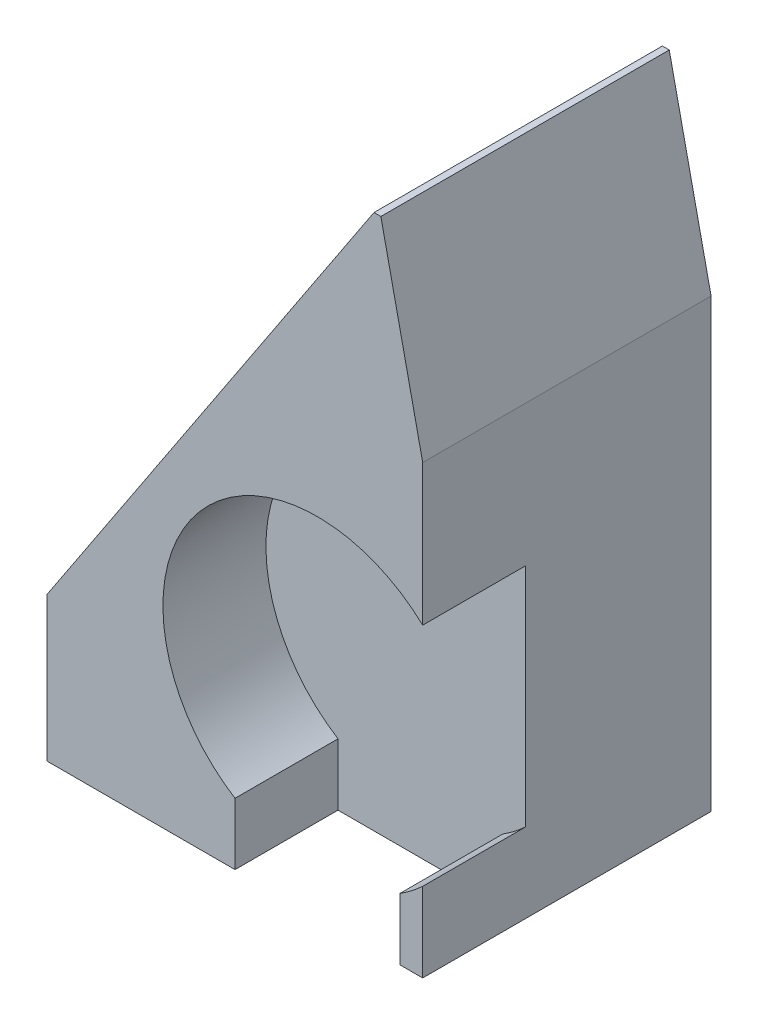
ISO-10303-21;
HEADER;
FILE_DESCRIPTION(('STEP AP214'),'2;1');
FILE_NAME('part.step','',(''),(''),'','','');
FILE_SCHEMA(('AUTOMOTIVE_DESIGN { 1 0 10303 214 1 1 1 1 }'));
ENDSEC;
DATA;
#1=APPLICATION_CONTEXT('core data for automotive mechanical design processes');
#2=APPLICATION_PROTOCOL_DEFINITION('international standard','automotive_design',2000,#1);
#3=PRODUCT_CONTEXT('',#1,'mechanical');
#4=PRODUCT('Part','Part','',(#3));
#5=PRODUCT_RELATED_PRODUCT_CATEGORY('part','',(#4));
#6=PRODUCT_DEFINITION_FORMATION('','',#4);
#7=PRODUCT_DEFINITION_CONTEXT('part definition',#1,'design');
#8=PRODUCT_DEFINITION('design','',#6,#7);
#9=PRODUCT_DEFINITION_SHAPE('','',#8);
#10=(LENGTH_UNIT() NAMED_UNIT(*) SI_UNIT(.MILLI.,.METRE.));
#11=(NAMED_UNIT(*) PLANE_ANGLE_UNIT() SI_UNIT($,.RADIAN.));
#12=(NAMED_UNIT(*) SI_UNIT($,.STERADIAN.) SOLID_ANGLE_UNIT());
#13=UNCERTAINTY_MEASURE_WITH_UNIT(LENGTH_MEASURE(1.E-05),#10,'distance_accuracy_value','');
#14=(GEOMETRIC_REPRESENTATION_CONTEXT(3) GLOBAL_UNCERTAINTY_ASSIGNED_CONTEXT((#13)) GLOBAL_UNIT_ASSIGNED_CONTEXT((#10,
#11,#12)) REPRESENTATION_CONTEXT('',''));
#15=CARTESIAN_POINT('',(0.,0.,0.));
#16=DIRECTION('',(0.,0.,1.));
#17=DIRECTION('',(1.,0.,0.));
#18=AXIS2_PLACEMENT_3D('',#15,#16,#17);
#19=CARTESIAN_POINT('',(0.,0.,70.));
#20=DIRECTION('',(0.,0.,1.));
#21=DIRECTION('',(1.,0.,0.));
#22=AXIS2_PLACEMENT_3D('',#19,#20,#21);
#23=PLANE('',#22);
#24=CARTESIAN_POINT('',(-22.6679084803781,-28.7734336982965,70.));
#25=DIRECTION('',(0.,0.,1.));
#26=DIRECTION('',(1.,0.,0.));
#27=AXIS2_PLACEMENT_3D('',#24,#25,#26);
#28=CIRCLE('',#27,37.5);
#29=CARTESIAN_POINT('',(2.88209151962222,-1.3244355380724,70.));
#30=VERTEX_POINT('',#29);
#31=CARTESIAN_POINT('',(-42.6721194220356,-60.4922222092354,70.));
#32=VERTEX_POINT('',#31);
#33=EDGE_CURVE('E190',#30,#32,#28,.T.);
#34=ORIENTED_EDGE('',*,*,#33,.F.);
#35=DIRECTION('',(0.,1.,0.));
#36=VECTOR('',#35,1.);
#37=CARTESIAN_POINT('',(2.88209151962222,-40.4922222092354,70.));
#38=LINE('',#37,#36);
#39=CARTESIAN_POINT('',(2.88209151962222,32.8600757047892,70.));
#40=VERTEX_POINT('',#39);
#41=EDGE_CURVE('E204',#30,#40,#38,.T.);
#42=ORIENTED_EDGE('',*,*,#41,.T.);
#43=DIRECTION('',(-0.212686858193503,0.977120412411785,0.));
#44=VECTOR('',#43,1.);
#45=CARTESIAN_POINT('',(2.88209151962222,32.8600757047892,70.));
#46=LINE('',#45,#44);
#47=CARTESIAN_POINT('',(-7.27157334356914,79.5077777907646,70.));
#48=VERTEX_POINT('',#47);
#49=EDGE_CURVE('E206',#40,#48,#46,.T.);
#50=ORIENTED_EDGE('',*,*,#49,.T.);
#51=DIRECTION('',(-1.,0.,0.));
#52=VECTOR('',#51,1.);
#53=CARTESIAN_POINT('',(-7.27157334356914,79.5077777907646,70.));
#54=LINE('',#53,#52);
#55=CARTESIAN_POINT('',(-8.93782976289527,79.5077777907646,70.));
#56=VERTEX_POINT('',#55);
#57=EDGE_CURVE('E54',#48,#56,#54,.T.);
#58=ORIENTED_EDGE('',*,*,#57,.T.);
#59=DIRECTION('',(-0.551769207168103,-0.833996847728505,0.));
#60=VECTOR('',#59,1.);
#61=CARTESIAN_POINT('',(-8.93782976289527,79.5077777907646,70.));
#62=LINE('',#61,#60);
#63=CARTESIAN_POINT('',(-88.3293826692521,-40.4922222092354,70.));
#64=VERTEX_POINT('',#63);
#65=EDGE_CURVE('E80',#56,#64,#62,.T.);
#66=ORIENTED_EDGE('',*,*,#65,.T.);
#67=DIRECTION('',(0.,1.,0.));
#68=VECTOR('',#67,1.);
#69=CARTESIAN_POINT('',(-88.3293826692521,-60.4922222092354,70.));
#70=LINE('',#69,#68);
#71=CARTESIAN_POINT('',(-88.3293826692521,-75.4922222092354,70.));
#72=VERTEX_POINT('',#71);
#73=EDGE_CURVE('E198',#72,#64,#70,.T.);
#74=ORIENTED_EDGE('',*,*,#73,.F.);
#75=DIRECTION('',(-1.,0.,0.));
#76=VECTOR('',#75,1.);
#77=CARTESIAN_POINT('',(-42.6721194220356,-75.4922222092354,70.));
#78=LINE('',#77,#76);
#79=CARTESIAN_POINT('',(-42.6721194220356,-75.4922222092354,70.));
#80=VERTEX_POINT('',#79);
#81=EDGE_CURVE('E169',#80,#72,#78,.T.);
#82=ORIENTED_EDGE('',*,*,#81,.F.);
#83=DIRECTION('',(0.,1.,0.));
#84=VECTOR('',#83,1.);
#85=CARTESIAN_POINT('',(-42.6721194220356,-75.4922222092354,70.));
#86=LINE('',#85,#84);
#87=EDGE_CURVE('E172',#80,#32,#86,.T.);
#88=ORIENTED_EDGE('',*,*,#87,.T.);
#89=EDGE_LOOP('',(#34,#42,#50,#58,#66,#74,#82,#88));
#90=FACE_BOUND('',#89,.T.);
#91=ADVANCED_FACE('F37',(#90),#23,.T.);
#92=CARTESIAN_POINT('',(-8.93782976289527,79.5077777907646,70.));
#93=DIRECTION('',(0.833996847728505,-0.551769207168103,0.));
#94=DIRECTION('',(0.551769207168103,0.833996847728505,0.));
#95=AXIS2_PLACEMENT_3D('',#92,#93,#94);
#96=PLANE('',#95);
#97=DIRECTION('',(-0.551769207168103,-0.833996847728505,0.));
#98=VECTOR('',#97,1.);
#99=CARTESIAN_POINT('',(-8.93782976289527,79.5077777907646,0.));
#100=LINE('',#99,#98);
#101=CARTESIAN_POINT('',(-8.93782976289527,79.5077777907646,0.));
#102=VERTEX_POINT('',#101);
#103=CARTESIAN_POINT('',(-88.3293826692521,-40.4922222092354,0.));
#104=VERTEX_POINT('',#103);
#105=EDGE_CURVE('E142',#102,#104,#100,.T.);
#106=ORIENTED_EDGE('',*,*,#105,.T.);
#107=DIRECTION('',(0.,0.,-1.));
#108=VECTOR('',#107,1.);
#109=CARTESIAN_POINT('',(-88.3293826692521,-40.4922222092354,70.));
#110=LINE('',#109,#108);
#111=EDGE_CURVE('E218',#64,#104,#110,.T.);
#112=ORIENTED_EDGE('',*,*,#111,.F.);
#113=ORIENTED_EDGE('',*,*,#65,.F.);
#114=DIRECTION('',(0.,0.,-1.));
#115=VECTOR('',#114,1.);
#116=CARTESIAN_POINT('',(-8.93782976289527,79.5077777907646,70.));
#117=LINE('',#116,#115);
#118=EDGE_CURVE('E209',#56,#102,#117,.T.);
#119=ORIENTED_EDGE('',*,*,#118,.T.);
#120=EDGE_LOOP('',(#106,#112,#113,#119));
#121=FACE_BOUND('',#120,.T.);
#122=ADVANCED_FACE('F39',(#121),#96,.F.);
#123=CARTESIAN_POINT('',(2.88209151962222,-40.4922222092354,70.));
#124=DIRECTION('',(-1.,0.,0.));
#125=DIRECTION('',(0.,0.,1.));
#126=AXIS2_PLACEMENT_3D('',#123,#124,#125);
#127=PLANE('',#126);
#128=DIRECTION('',(0.,1.,0.));
#129=VECTOR('',#128,1.);
#130=CARTESIAN_POINT('',(2.88209151962222,-40.4922222092354,45.));
#131=LINE('',#130,#129);
#132=CARTESIAN_POINT('',(2.88209151962222,-56.2224318585206,45.));
#133=VERTEX_POINT('',#132);
#134=CARTESIAN_POINT('',(2.88209151962222,-1.3244355380724,45.));
#135=VERTEX_POINT('',#134);
#136=EDGE_CURVE('E188',#133,#135,#131,.T.);
#137=ORIENTED_EDGE('',*,*,#136,.F.);
#138=DIRECTION('',(0.,0.,1.));
#139=VECTOR('',#138,1.);
#140=CARTESIAN_POINT('',(2.88209151962222,-56.2224318585206,45.));
#141=LINE('',#140,#139);
#142=CARTESIAN_POINT('',(2.88209151962222,-56.2224318585206,70.));
#143=VERTEX_POINT('',#142);
#144=EDGE_CURVE('E196',#133,#143,#141,.T.);
#145=ORIENTED_EDGE('',*,*,#144,.T.);
#146=CARTESIAN_POINT('',(2.88209151962223,-75.4922222092354,70.));
#147=VERTEX_POINT('',#146);
#148=EDGE_CURVE('E150',#147,#143,#38,.T.);
#149=ORIENTED_EDGE('',*,*,#148,.F.);
#150=DIRECTION('',(0.,0.,1.));
#151=VECTOR('',#150,1.);
#152=CARTESIAN_POINT('',(2.88209151962223,-75.4922222092354,0.));
#153=LINE('',#152,#151);
#154=CARTESIAN_POINT('',(2.88209151962223,-75.4922222092354,0.));
#155=VERTEX_POINT('',#154);
#156=EDGE_CURVE('E145',#155,#147,#153,.T.);
#157=ORIENTED_EDGE('',*,*,#156,.F.);
#158=DIRECTION('',(0.,1.,0.));
#159=VECTOR('',#158,1.);
#160=CARTESIAN_POINT('',(2.88209151962222,-40.4922222092354,0.));
#161=LINE('',#160,#159);
#162=CARTESIAN_POINT('',(2.88209151962222,32.8600757047892,0.));
#163=VERTEX_POINT('',#162);
#164=EDGE_CURVE('E133',#155,#163,#161,.T.);
#165=ORIENTED_EDGE('',*,*,#164,.T.);
#166=DIRECTION('',(0.,0.,-1.));
#167=VECTOR('',#166,1.);
#168=CARTESIAN_POINT('',(2.88209151962222,32.8600757047892,70.));
#169=LINE('',#168,#167);
#170=EDGE_CURVE('E216',#40,#163,#169,.T.);
#171=ORIENTED_EDGE('',*,*,#170,.F.);
#172=ORIENTED_EDGE('',*,*,#41,.F.);
#173=DIRECTION('',(0.,0.,1.));
#174=VECTOR('',#173,1.);
#175=CARTESIAN_POINT('',(2.88209151962222,-1.3244355380724,45.));
#176=LINE('',#175,#174);
#177=EDGE_CURVE('E193',#30,#135,#176,.F.);
#178=ORIENTED_EDGE('',*,*,#177,.T.);
#179=EDGE_LOOP('',(#137,#145,#149,#157,#165,#171,#172,#178));
#180=FACE_BOUND('',#179,.T.);
#181=ADVANCED_FACE('F147',(#180),#127,.F.);
#182=CARTESIAN_POINT('',(2.88209151962222,32.8600757047892,70.));
#183=DIRECTION('',(-0.977120412411785,-0.212686858193503,0.));
#184=DIRECTION('',(0.212686858193503,-0.977120412411785,0.));
#185=AXIS2_PLACEMENT_3D('',#182,#183,#184);
#186=PLANE('',#185);
#187=DIRECTION('',(-0.212686858193503,0.977120412411785,0.));
#188=VECTOR('',#187,1.);
#189=CARTESIAN_POINT('',(2.88209151962222,32.8600757047892,0.));
#190=LINE('',#189,#188);
#191=CARTESIAN_POINT('',(-7.27157334356914,79.5077777907646,0.));
#192=VERTEX_POINT('',#191);
#193=EDGE_CURVE('E69',#163,#192,#190,.T.);
#194=ORIENTED_EDGE('',*,*,#193,.T.);
#195=DIRECTION('',(0.,0.,-1.));
#196=VECTOR('',#195,1.);
#197=CARTESIAN_POINT('',(-7.27157334356914,79.5077777907646,70.));
#198=LINE('',#197,#196);
#199=EDGE_CURVE('E214',#48,#192,#198,.T.);
#200=ORIENTED_EDGE('',*,*,#199,.F.);
#201=ORIENTED_EDGE('',*,*,#49,.F.);
#202=ORIENTED_EDGE('',*,*,#170,.T.);
#203=EDGE_LOOP('',(#194,#200,#201,#202));
#204=FACE_BOUND('',#203,.T.);
#205=ADVANCED_FACE('F256',(#204),#186,.F.);
#206=CARTESIAN_POINT('',(-7.27157334356914,79.5077777907646,70.));
#207=DIRECTION('',(0.,-1.,0.));
#208=DIRECTION('',(0.,0.,-1.));
#209=AXIS2_PLACEMENT_3D('',#206,#207,#208);
#210=PLANE('',#209);
#211=DIRECTION('',(-1.,0.,0.));
#212=VECTOR('',#211,1.);
#213=CARTESIAN_POINT('',(-7.27157334356914,79.5077777907646,0.));
#214=LINE('',#213,#212);
#215=EDGE_CURVE('E75',#192,#102,#214,.T.);
#216=ORIENTED_EDGE('',*,*,#215,.T.);
#217=ORIENTED_EDGE('',*,*,#118,.F.);
#218=ORIENTED_EDGE('',*,*,#57,.F.);
#219=ORIENTED_EDGE('',*,*,#199,.T.);
#220=EDGE_LOOP('',(#216,#217,#218,#219));
#221=FACE_BOUND('',#220,.T.);
#222=ADVANCED_FACE('F247',(#221),#210,.F.);
#223=CARTESIAN_POINT('',(-2.66369753872055,-60.4922222092354,70.));
#224=VERTEX_POINT('',#223);
#225=EDGE_CURVE('E184',#224,#143,#28,.T.);
#226=ORIENTED_EDGE('',*,*,#225,.F.);
#227=DIRECTION('',(0.,1.,0.));
#228=VECTOR('',#227,1.);
#229=CARTESIAN_POINT('',(-2.66369753872055,-75.4922222092354,70.));
#230=LINE('',#229,#228);
#231=CARTESIAN_POINT('',(-2.66369753872055,-75.4922222092354,70.));
#232=VERTEX_POINT('',#231);
#233=EDGE_CURVE('E181',#232,#224,#230,.T.);
#234=ORIENTED_EDGE('',*,*,#233,.F.);
#235=DIRECTION('',(-1.,0.,0.));
#236=VECTOR('',#235,1.);
#237=CARTESIAN_POINT('',(2.88209151962223,-75.4922222092354,70.));
#238=LINE('',#237,#236);
#239=EDGE_CURVE('E153',#147,#232,#238,.T.);
#240=ORIENTED_EDGE('',*,*,#239,.F.);
#241=ORIENTED_EDGE('',*,*,#148,.T.);
#242=EDGE_LOOP('',(#226,#234,#240,#241));
#243=FACE_BOUND('',#242,.T.);
#244=ADVANCED_FACE('F245',(#243),#23,.T.);
#245=CARTESIAN_POINT('',(0.,0.,0.));
#246=DIRECTION('',(0.,0.,1.));
#247=DIRECTION('',(1.,0.,0.));
#248=AXIS2_PLACEMENT_3D('',#245,#246,#247);
#249=PLANE('',#248);
#250=ORIENTED_EDGE('',*,*,#105,.F.);
#251=ORIENTED_EDGE('',*,*,#215,.F.);
#252=ORIENTED_EDGE('',*,*,#193,.F.);
#253=ORIENTED_EDGE('',*,*,#164,.F.);
#254=DIRECTION('',(1.,0.,0.));
#255=VECTOR('',#254,1.);
#256=CARTESIAN_POINT('',(-88.3293826692521,-75.4922222092354,0.));
#257=LINE('',#256,#255);
#258=CARTESIAN_POINT('',(-88.3293826692521,-75.4922222092354,0.));
#259=VERTEX_POINT('',#258);
#260=EDGE_CURVE('E139',#259,#155,#257,.T.);
#261=ORIENTED_EDGE('',*,*,#260,.F.);
#262=DIRECTION('',(0.,1.,0.));
#263=VECTOR('',#262,1.);
#264=CARTESIAN_POINT('',(-88.3293826692521,-60.4922222092354,0.));
#265=LINE('',#264,#263);
#266=EDGE_CURVE('E201',#259,#104,#265,.T.);
#267=ORIENTED_EDGE('',*,*,#266,.T.);
#268=EDGE_LOOP('',(#250,#251,#252,#253,#261,#267));
#269=FACE_BOUND('',#268,.T.);
#270=ADVANCED_FACE('F136',(#269),#249,.F.);
#271=CARTESIAN_POINT('',(-88.3293826692521,-60.4922222092354,70.));
#272=DIRECTION('',(1.,0.,0.));
#273=DIRECTION('',(0.,1.,0.));
#274=AXIS2_PLACEMENT_3D('',#271,#272,#273);
#275=PLANE('',#274);
#276=ORIENTED_EDGE('',*,*,#111,.T.);
#277=ORIENTED_EDGE('',*,*,#266,.F.);
#278=DIRECTION('',(0.,0.,-1.));
#279=VECTOR('',#278,1.);
#280=CARTESIAN_POINT('',(-88.3293826692521,-75.4922222092354,70.));
#281=LINE('',#280,#279);
#282=EDGE_CURVE('E159',#72,#259,#281,.T.);
#283=ORIENTED_EDGE('',*,*,#282,.F.);
#284=ORIENTED_EDGE('',*,*,#73,.T.);
#285=EDGE_LOOP('',(#276,#277,#283,#284));
#286=FACE_BOUND('',#285,.T.);
#287=ADVANCED_FACE('F253',(#286),#275,.F.);
#288=CARTESIAN_POINT('',(-22.6679084803781,-28.7734336982965,45.));
#289=DIRECTION('',(0.,0.,1.));
#290=DIRECTION('',(1.,0.,0.));
#291=AXIS2_PLACEMENT_3D('',#288,#289,#290);
#292=CYLINDRICAL_SURFACE('',#291,37.5);
#293=CARTESIAN_POINT('',(-22.6679084803781,-28.7734336982965,45.));
#294=DIRECTION('',(0.,0.,1.));
#295=DIRECTION('',(1.,0.,0.));
#296=AXIS2_PLACEMENT_3D('',#293,#294,#295);
#297=CIRCLE('',#296,37.5);
#298=CARTESIAN_POINT('',(-2.66369753872055,-60.4922222092354,45.));
#299=VERTEX_POINT('',#298);
#300=EDGE_CURVE('E189',#299,#133,#297,.T.);
#301=ORIENTED_EDGE('',*,*,#300,.F.);
#302=DIRECTION('',(0.,0.,1.));
#303=VECTOR('',#302,1.);
#304=CARTESIAN_POINT('',(-2.66369753872055,-60.4922222092354,45.));
#305=LINE('',#304,#303);
#306=EDGE_CURVE('E11',#299,#224,#305,.T.);
#307=ORIENTED_EDGE('',*,*,#306,.T.);
#308=ORIENTED_EDGE('',*,*,#225,.T.);
#309=ORIENTED_EDGE('',*,*,#144,.F.);
#310=EDGE_LOOP('',(#301,#307,#308,#309));
#311=FACE_BOUND('',#310,.T.);
#312=ADVANCED_FACE('F243',(#311),#292,.F.);
#313=ORIENTED_EDGE('',*,*,#33,.T.);
#314=DIRECTION('',(0.,0.,1.));
#315=VECTOR('',#314,1.);
#316=CARTESIAN_POINT('',(-42.6721194220356,-60.4922222092354,45.));
#317=LINE('',#316,#315);
#318=CARTESIAN_POINT('',(-42.6721194220356,-60.4922222092354,45.));
#319=VERTEX_POINT('',#318);
#320=EDGE_CURVE('E46',#32,#319,#317,.F.);
#321=ORIENTED_EDGE('',*,*,#320,.T.);
#322=EDGE_CURVE('E185',#135,#319,#297,.T.);
#323=ORIENTED_EDGE('',*,*,#322,.F.);
#324=ORIENTED_EDGE('',*,*,#177,.F.);
#325=EDGE_LOOP('',(#313,#321,#323,#324));
#326=FACE_BOUND('',#325,.T.);
#327=ADVANCED_FACE('F223',(#326),#292,.F.);
#328=CARTESIAN_POINT('',(-22.6679084803781,-28.7734336982965,45.));
#329=DIRECTION('',(0.,0.,1.));
#330=DIRECTION('',(1.,0.,0.));
#331=AXIS2_PLACEMENT_3D('',#328,#329,#330);
#332=PLANE('',#331);
#333=ORIENTED_EDGE('',*,*,#136,.T.);
#334=ORIENTED_EDGE('',*,*,#322,.T.);
#335=DIRECTION('',(0.,1.,0.));
#336=VECTOR('',#335,1.);
#337=CARTESIAN_POINT('',(-42.6721194220356,-75.4922222092354,45.));
#338=LINE('',#337,#336);
#339=CARTESIAN_POINT('',(-42.6721194220356,-75.4922222092354,45.));
#340=VERTEX_POINT('',#339);
#341=EDGE_CURVE('E175',#340,#319,#338,.T.);
#342=ORIENTED_EDGE('',*,*,#341,.F.);
#343=DIRECTION('',(-1.,0.,0.));
#344=VECTOR('',#343,1.);
#345=CARTESIAN_POINT('',(-2.66369753872055,-75.4922222092354,45.));
#346=LINE('',#345,#344);
#347=CARTESIAN_POINT('',(-2.66369753872055,-75.4922222092354,45.));
#348=VERTEX_POINT('',#347);
#349=EDGE_CURVE('E165',#348,#340,#346,.T.);
#350=ORIENTED_EDGE('',*,*,#349,.F.);
#351=DIRECTION('',(0.,1.,0.));
#352=VECTOR('',#351,1.);
#353=CARTESIAN_POINT('',(-2.66369753872055,-75.4922222092354,45.));
#354=LINE('',#353,#352);
#355=EDGE_CURVE('E178',#348,#299,#354,.T.);
#356=ORIENTED_EDGE('',*,*,#355,.T.);
#357=ORIENTED_EDGE('',*,*,#300,.T.);
#358=EDGE_LOOP('',(#333,#334,#342,#350,#356,#357));
#359=FACE_BOUND('',#358,.T.);
#360=ADVANCED_FACE('F229',(#359),#332,.T.);
#361=CARTESIAN_POINT('',(-2.66369753872055,-75.4922222092354,70.));
#362=DIRECTION('',(1.,0.,0.));
#363=DIRECTION('',(0.,1.,0.));
#364=AXIS2_PLACEMENT_3D('',#361,#362,#363);
#365=PLANE('',#364);
#366=ORIENTED_EDGE('',*,*,#306,.F.);
#367=ORIENTED_EDGE('',*,*,#355,.F.);
#368=DIRECTION('',(0.,0.,-1.));
#369=VECTOR('',#368,1.);
#370=CARTESIAN_POINT('',(-2.66369753872055,-75.4922222092354,70.));
#371=LINE('',#370,#369);
#372=EDGE_CURVE('E163',#232,#348,#371,.T.);
#373=ORIENTED_EDGE('',*,*,#372,.F.);
#374=ORIENTED_EDGE('',*,*,#233,.T.);
#375=EDGE_LOOP('',(#366,#367,#373,#374));
#376=FACE_BOUND('',#375,.T.);
#377=ADVANCED_FACE('F239',(#376),#365,.F.);
#378=CARTESIAN_POINT('',(-42.6721194220356,-75.4922222092354,45.));
#379=DIRECTION('',(-1.,0.,0.));
#380=DIRECTION('',(0.,-1.,0.));
#381=AXIS2_PLACEMENT_3D('',#378,#379,#380);
#382=PLANE('',#381);
#383=ORIENTED_EDGE('',*,*,#320,.F.);
#384=ORIENTED_EDGE('',*,*,#87,.F.);
#385=DIRECTION('',(0.,0.,1.));
#386=VECTOR('',#385,1.);
#387=CARTESIAN_POINT('',(-42.6721194220356,-75.4922222092354,45.));
#388=LINE('',#387,#386);
#389=EDGE_CURVE('E167',#340,#80,#388,.T.);
#390=ORIENTED_EDGE('',*,*,#389,.F.);
#391=ORIENTED_EDGE('',*,*,#341,.T.);
#392=EDGE_LOOP('',(#383,#384,#390,#391));
#393=FACE_BOUND('',#392,.T.);
#394=ADVANCED_FACE('F233',(#393),#382,.F.);
#395=CARTESIAN_POINT('',(0.,-75.4922222092354,0.));
#396=DIRECTION('',(0.,-1.,0.));
#397=DIRECTION('',(1.,0.,0.));
#398=AXIS2_PLACEMENT_3D('',#395,#396,#397);
#399=PLANE('',#398);
#400=ORIENTED_EDGE('',*,*,#260,.T.);
#401=ORIENTED_EDGE('',*,*,#156,.T.);
#402=ORIENTED_EDGE('',*,*,#239,.T.);
#403=ORIENTED_EDGE('',*,*,#372,.T.);
#404=ORIENTED_EDGE('',*,*,#349,.T.);
#405=ORIENTED_EDGE('',*,*,#389,.T.);
#406=ORIENTED_EDGE('',*,*,#81,.T.);
#407=ORIENTED_EDGE('',*,*,#282,.T.);
#408=EDGE_LOOP('',(#400,#401,#402,#403,#404,#405,#406,#407));
#409=FACE_BOUND('',#408,.T.);
#410=ADVANCED_FACE('F156',(#409),#399,.T.);
#411=CLOSED_SHELL('',(#91,#122,#181,#205,#222,#244,#270,#287,#312,#327,#360,#377,#394,#410));
#412=MANIFOLD_SOLID_BREP('B2',#411);
#413=ADVANCED_BREP_SHAPE_REPRESENTATION('',(#18,#412),#14);
#414=SHAPE_DEFINITION_REPRESENTATION(#9,#413);
ENDSEC;
END-ISO-10303-21;
